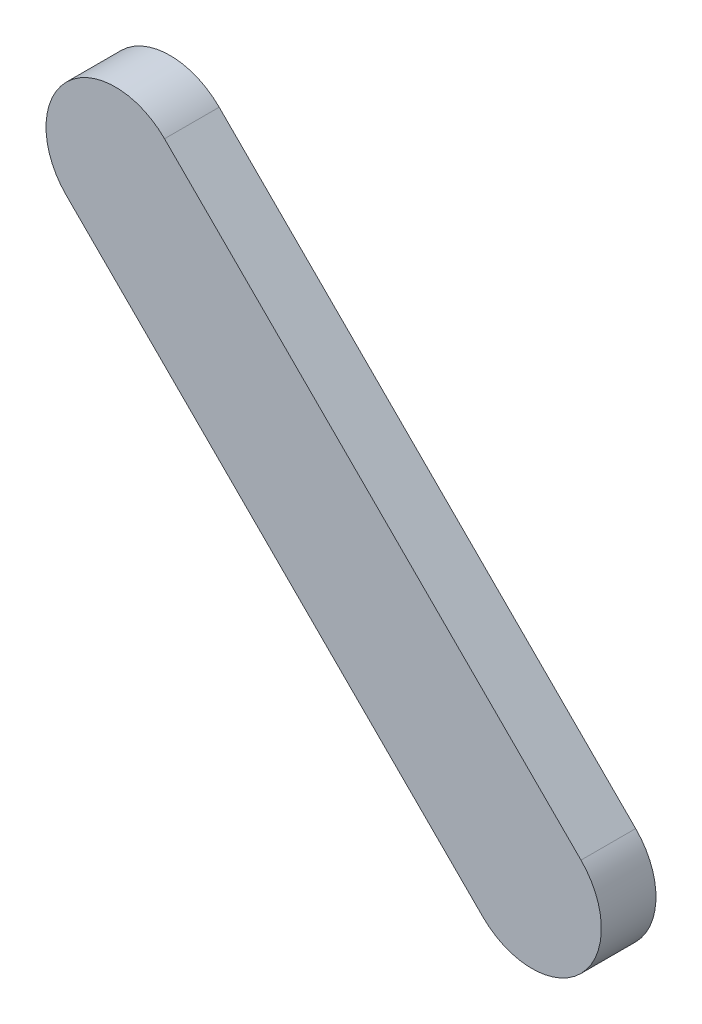
ISO-10303-21;
HEADER;
FILE_DESCRIPTION(('STEP AP214'),'2;1');
FILE_NAME('part.step','',(''),(''),'','','');
FILE_SCHEMA(('AUTOMOTIVE_DESIGN { 1 0 10303 214 1 1 1 1 }'));
ENDSEC;
DATA;
#1=APPLICATION_CONTEXT('core data for automotive mechanical design processes');
#2=APPLICATION_PROTOCOL_DEFINITION('international standard','automotive_design',2000,#1);
#3=PRODUCT_CONTEXT('',#1,'mechanical');
#4=PRODUCT('Part','Part','',(#3));
#5=PRODUCT_RELATED_PRODUCT_CATEGORY('part','',(#4));
#6=PRODUCT_DEFINITION_FORMATION('','',#4);
#7=PRODUCT_DEFINITION_CONTEXT('part definition',#1,'design');
#8=PRODUCT_DEFINITION('design','',#6,#7);
#9=PRODUCT_DEFINITION_SHAPE('','',#8);
#10=(LENGTH_UNIT() NAMED_UNIT(*) SI_UNIT(.MILLI.,.METRE.));
#11=(NAMED_UNIT(*) PLANE_ANGLE_UNIT() SI_UNIT($,.RADIAN.));
#12=(NAMED_UNIT(*) SI_UNIT($,.STERADIAN.) SOLID_ANGLE_UNIT());
#13=UNCERTAINTY_MEASURE_WITH_UNIT(LENGTH_MEASURE(1.E-05),#10,'distance_accuracy_value','');
#14=(GEOMETRIC_REPRESENTATION_CONTEXT(3) GLOBAL_UNCERTAINTY_ASSIGNED_CONTEXT((#13)) GLOBAL_UNIT_ASSIGNED_CONTEXT((#10,
#11,#12)) REPRESENTATION_CONTEXT('',''));
#15=CARTESIAN_POINT('',(0.,0.,0.));
#16=DIRECTION('',(0.,0.,1.));
#17=DIRECTION('',(1.,0.,0.));
#18=AXIS2_PLACEMENT_3D('',#15,#16,#17);
#19=CARTESIAN_POINT('',(133.29739406,113.99339406,0.));
#20=DIRECTION('',(0.707106781186548,0.707106781186548,0.));
#21=DIRECTION('',(0.707106781186548,-0.707106781186548,0.));
#22=AXIS2_PLACEMENT_3D('',#19,#20,#21);
#23=PLANE('',#22);
#24=DIRECTION('',(0.707106781186548,-0.707106781186548,0.));
#25=VECTOR('',#24,1.);
#26=CARTESIAN_POINT('',(133.29739406,113.99339406,0.1999996));
#27=LINE('',#26,#25);
#28=CARTESIAN_POINT('',(133.29739406,113.99339406,0.1999996));
#29=VERTEX_POINT('',#28);
#30=CARTESIAN_POINT('',(134.82139406,112.46939406,0.1999996));
#31=VERTEX_POINT('',#30);
#32=EDGE_CURVE('E11',#29,#31,#27,.T.);
#33=ORIENTED_EDGE('',*,*,#32,.F.);
#34=DIRECTION('',(0.,0.,1.));
#35=VECTOR('',#34,1.);
#36=CARTESIAN_POINT('',(133.29739406,113.99339406,0.));
#37=LINE('',#36,#35);
#38=CARTESIAN_POINT('',(133.29739406,113.99339406,0.));
#39=VERTEX_POINT('',#38);
#40=EDGE_CURVE('E24',#39,#29,#37,.T.);
#41=ORIENTED_EDGE('',*,*,#40,.F.);
#42=DIRECTION('',(0.707106781186548,-0.707106781186548,0.));
#43=VECTOR('',#42,1.);
#44=CARTESIAN_POINT('',(133.29739406,113.99339406,0.));
#45=LINE('',#44,#43);
#46=CARTESIAN_POINT('',(134.82139406,112.46939406,0.));
#47=VERTEX_POINT('',#46);
#48=EDGE_CURVE('E75',#39,#47,#45,.T.);
#49=ORIENTED_EDGE('',*,*,#48,.T.);
#50=DIRECTION('',(0.,0.,1.));
#51=VECTOR('',#50,1.);
#52=CARTESIAN_POINT('',(134.82139406,112.46939406,0.));
#53=LINE('',#52,#51);
#54=EDGE_CURVE('E37',#47,#31,#53,.T.);
#55=ORIENTED_EDGE('',*,*,#54,.T.);
#56=EDGE_LOOP('',(#33,#41,#49,#55));
#57=FACE_BOUND('',#56,.T.);
#58=ADVANCED_FACE('F17',(#57),#23,.F.);
#59=CARTESIAN_POINT('',(135.001,112.649,0.));
#60=DIRECTION('',(0.,0.,-1.));
#61=DIRECTION('',(-0.70710678118652,-0.707106781186576,0.));
#62=AXIS2_PLACEMENT_3D('',#59,#60,#61);
#63=CYLINDRICAL_SURFACE('',#62,0.254001156230774);
#64=CARTESIAN_POINT('',(135.001,112.649,0.1999996));
#65=DIRECTION('',(0.,0.,1.));
#66=DIRECTION('',(-0.70710678118652,-0.707106781186576,0.));
#67=AXIS2_PLACEMENT_3D('',#64,#65,#66);
#68=CIRCLE('',#67,0.254001156230774);
#69=CARTESIAN_POINT('',(135.18060594,112.82860594,0.1999996));
#70=VERTEX_POINT('',#69);
#71=EDGE_CURVE('E83',#31,#70,#68,.T.);
#72=ORIENTED_EDGE('',*,*,#71,.F.);
#73=ORIENTED_EDGE('',*,*,#54,.F.);
#74=CARTESIAN_POINT('',(135.001,112.649,0.));
#75=DIRECTION('',(0.,0.,1.));
#76=DIRECTION('',(-0.70710678118652,-0.707106781186576,0.));
#77=AXIS2_PLACEMENT_3D('',#74,#75,#76);
#78=CIRCLE('',#77,0.254001156230774);
#79=CARTESIAN_POINT('',(135.18060594,112.82860594,0.));
#80=VERTEX_POINT('',#79);
#81=EDGE_CURVE('E81',#47,#80,#78,.T.);
#82=ORIENTED_EDGE('',*,*,#81,.T.);
#83=DIRECTION('',(0.,0.,1.));
#84=VECTOR('',#83,1.);
#85=CARTESIAN_POINT('',(135.18060594,112.82860594,0.));
#86=LINE('',#85,#84);
#87=EDGE_CURVE('E67',#80,#70,#86,.T.);
#88=ORIENTED_EDGE('',*,*,#87,.T.);
#89=EDGE_LOOP('',(#72,#73,#82,#88));
#90=FACE_BOUND('',#89,.T.);
#91=ADVANCED_FACE('F89',(#90),#63,.T.);
#92=CARTESIAN_POINT('',(135.18060594,112.82860594,0.));
#93=DIRECTION('',(-0.707106781186548,-0.707106781186548,0.));
#94=DIRECTION('',(-0.707106781186548,0.707106781186548,0.));
#95=AXIS2_PLACEMENT_3D('',#92,#93,#94);
#96=PLANE('',#95);
#97=DIRECTION('',(-0.707106781186548,0.707106781186548,0.));
#98=VECTOR('',#97,1.);
#99=CARTESIAN_POINT('',(135.18060594,112.82860594,0.1999996));
#100=LINE('',#99,#98);
#101=CARTESIAN_POINT('',(133.65660594,114.35260594,0.1999996));
#102=VERTEX_POINT('',#101);
#103=EDGE_CURVE('E71',#70,#102,#100,.T.);
#104=ORIENTED_EDGE('',*,*,#103,.F.);
#105=ORIENTED_EDGE('',*,*,#87,.F.);
#106=DIRECTION('',(-0.707106781186548,0.707106781186548,0.));
#107=VECTOR('',#106,1.);
#108=CARTESIAN_POINT('',(135.18060594,112.82860594,0.));
#109=LINE('',#108,#107);
#110=CARTESIAN_POINT('',(133.65660594,114.35260594,0.));
#111=VERTEX_POINT('',#110);
#112=EDGE_CURVE('E63',#80,#111,#109,.T.);
#113=ORIENTED_EDGE('',*,*,#112,.T.);
#114=DIRECTION('',(0.,0.,1.));
#115=VECTOR('',#114,1.);
#116=CARTESIAN_POINT('',(133.65660594,114.35260594,0.));
#117=LINE('',#116,#115);
#118=EDGE_CURVE('E53',#111,#102,#117,.T.);
#119=ORIENTED_EDGE('',*,*,#118,.T.);
#120=EDGE_LOOP('',(#104,#105,#113,#119));
#121=FACE_BOUND('',#120,.T.);
#122=ADVANCED_FACE('F66',(#121),#96,.F.);
#123=CARTESIAN_POINT('',(133.477,114.173,0.));
#124=DIRECTION('',(0.,0.,-1.));
#125=DIRECTION('',(0.707106781186576,0.70710678118652,0.));
#126=AXIS2_PLACEMENT_3D('',#123,#124,#125);
#127=CYLINDRICAL_SURFACE('',#126,0.254001156230768);
#128=CARTESIAN_POINT('',(133.477,114.173,0.1999996));
#129=DIRECTION('',(0.,0.,1.));
#130=DIRECTION('',(0.707106781186576,0.70710678118652,0.));
#131=AXIS2_PLACEMENT_3D('',#128,#129,#130);
#132=CIRCLE('',#131,0.254001156230768);
#133=EDGE_CURVE('E59',#102,#29,#132,.T.);
#134=ORIENTED_EDGE('',*,*,#133,.F.);
#135=ORIENTED_EDGE('',*,*,#118,.F.);
#136=CARTESIAN_POINT('',(133.477,114.173,0.));
#137=DIRECTION('',(0.,0.,1.));
#138=DIRECTION('',(0.707106781186576,0.70710678118652,0.));
#139=AXIS2_PLACEMENT_3D('',#136,#137,#138);
#140=CIRCLE('',#139,0.254001156230768);
#141=EDGE_CURVE('E57',#111,#39,#140,.T.);
#142=ORIENTED_EDGE('',*,*,#141,.T.);
#143=ORIENTED_EDGE('',*,*,#40,.T.);
#144=EDGE_LOOP('',(#134,#135,#142,#143));
#145=FACE_BOUND('',#144,.T.);
#146=ADVANCED_FACE('F55',(#145),#127,.T.);
#147=CARTESIAN_POINT('',(133.29739406,113.99339406,0.));
#148=DIRECTION('',(0.,0.,-1.));
#149=DIRECTION('',(-1.,0.,0.));
#150=AXIS2_PLACEMENT_3D('',#147,#148,#149);
#151=PLANE('',#150);
#152=ORIENTED_EDGE('',*,*,#141,.F.);
#153=ORIENTED_EDGE('',*,*,#112,.F.);
#154=ORIENTED_EDGE('',*,*,#81,.F.);
#155=ORIENTED_EDGE('',*,*,#48,.F.);
#156=EDGE_LOOP('',(#152,#153,#154,#155));
#157=FACE_BOUND('',#156,.T.);
#158=ADVANCED_FACE('F74',(#157),#151,.T.);
#159=CARTESIAN_POINT('',(133.29739406,113.99339406,0.1999996));
#160=DIRECTION('',(0.,0.,-1.));
#161=DIRECTION('',(-1.,0.,0.));
#162=AXIS2_PLACEMENT_3D('',#159,#160,#161);
#163=PLANE('',#162);
#164=ORIENTED_EDGE('',*,*,#32,.T.);
#165=ORIENTED_EDGE('',*,*,#71,.T.);
#166=ORIENTED_EDGE('',*,*,#103,.T.);
#167=ORIENTED_EDGE('',*,*,#133,.T.);
#168=EDGE_LOOP('',(#164,#165,#166,#167));
#169=FACE_BOUND('',#168,.T.);
#170=ADVANCED_FACE('F91',(#169),#163,.F.);
#171=CLOSED_SHELL('',(#58,#91,#122,#146,#158,#170));
#172=MANIFOLD_SOLID_BREP('B1',#171);
#173=ADVANCED_BREP_SHAPE_REPRESENTATION('',(#18,#172),#14);
#174=SHAPE_DEFINITION_REPRESENTATION(#9,#173);
ENDSEC;
END-ISO-10303-21;
